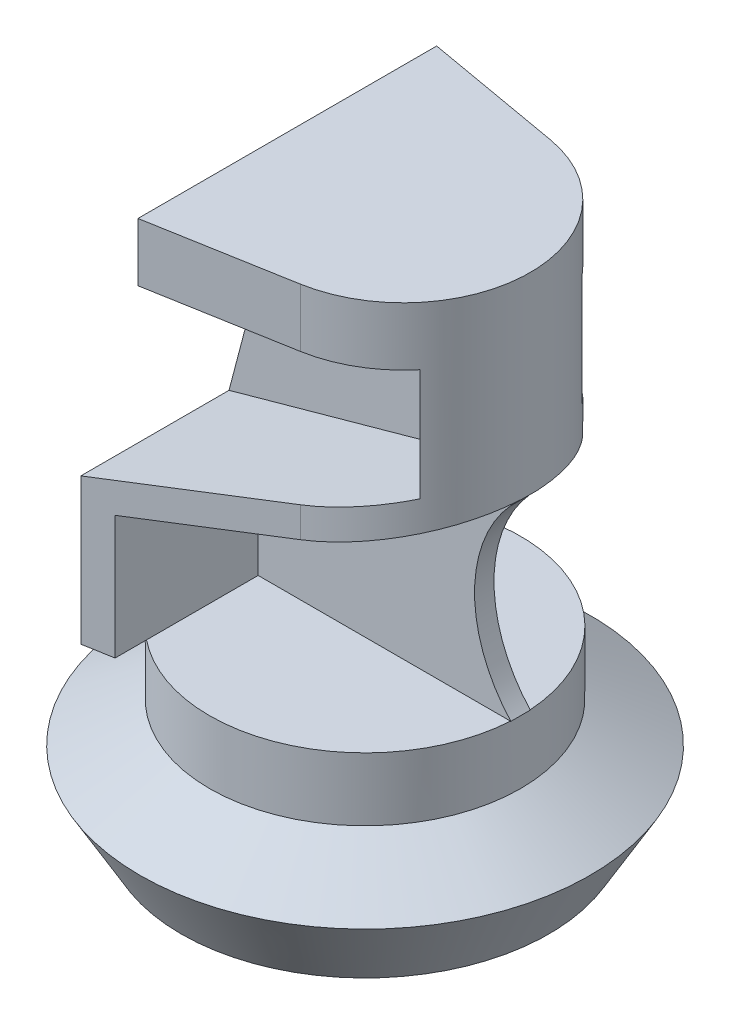
ISO-10303-21;
HEADER;
FILE_DESCRIPTION(('STEP AP214'),'2;1');
FILE_NAME('part.step','',(''),(''),'','','');
FILE_SCHEMA(('AUTOMOTIVE_DESIGN { 1 0 10303 214 1 1 1 1 }'));
ENDSEC;
DATA;
#1=APPLICATION_CONTEXT('core data for automotive mechanical design processes');
#2=APPLICATION_PROTOCOL_DEFINITION('international standard','automotive_design',2000,#1);
#3=PRODUCT_CONTEXT('',#1,'mechanical');
#4=PRODUCT('Part','Part','',(#3));
#5=PRODUCT_RELATED_PRODUCT_CATEGORY('part','',(#4));
#6=PRODUCT_DEFINITION_FORMATION('','',#4);
#7=PRODUCT_DEFINITION_CONTEXT('part definition',#1,'design');
#8=PRODUCT_DEFINITION('design','',#6,#7);
#9=PRODUCT_DEFINITION_SHAPE('','',#8);
#10=(LENGTH_UNIT() NAMED_UNIT(*) SI_UNIT(.MILLI.,.METRE.));
#11=(NAMED_UNIT(*) PLANE_ANGLE_UNIT() SI_UNIT($,.RADIAN.));
#12=(NAMED_UNIT(*) SI_UNIT($,.STERADIAN.) SOLID_ANGLE_UNIT());
#13=UNCERTAINTY_MEASURE_WITH_UNIT(LENGTH_MEASURE(1.E-05),#10,'distance_accuracy_value','');
#14=(GEOMETRIC_REPRESENTATION_CONTEXT(3) GLOBAL_UNCERTAINTY_ASSIGNED_CONTEXT((#13)) GLOBAL_UNIT_ASSIGNED_CONTEXT((#10,
#11,#12)) REPRESENTATION_CONTEXT('',''));
#15=CARTESIAN_POINT('',(0.,0.,0.));
#16=DIRECTION('',(0.,0.,1.));
#17=DIRECTION('',(1.,0.,0.));
#18=AXIS2_PLACEMENT_3D('',#15,#16,#17);
#19=CARTESIAN_POINT('',(0.,68.,40.));
#20=DIRECTION('',(0.,-1.,0.));
#21=DIRECTION('',(0.,0.,-1.));
#22=AXIS2_PLACEMENT_3D('',#19,#20,#21);
#23=PLANE('',#22);
#24=DIRECTION('',(0.,0.,-1.));
#25=VECTOR('',#24,1.);
#26=CARTESIAN_POINT('',(28.,68.,40.));
#27=LINE('',#26,#25);
#28=CARTESIAN_POINT('',(28.,68.,-2.));
#29=VERTEX_POINT('',#28);
#30=CARTESIAN_POINT('',(28.,68.,-16.6578604852397));
#31=VERTEX_POINT('',#30);
#32=EDGE_CURVE('E232',#29,#31,#27,.T.);
#33=ORIENTED_EDGE('',*,*,#32,.F.);
#34=DIRECTION('',(-1.,0.,0.));
#35=VECTOR('',#34,1.);
#36=CARTESIAN_POINT('',(0.,68.,-2.));
#37=LINE('',#36,#35);
#38=CARTESIAN_POINT('',(-16.,68.,-2.));
#39=VERTEX_POINT('',#38);
#40=EDGE_CURVE('E220',#29,#39,#37,.T.);
#41=ORIENTED_EDGE('',*,*,#40,.T.);
#42=DIRECTION('',(0.,0.,-1.));
#43=VECTOR('',#42,1.);
#44=CARTESIAN_POINT('',(-16.,68.,40.));
#45=LINE('',#44,#43);
#46=CARTESIAN_POINT('',(-16.,68.,-30.7367301929154));
#47=VERTEX_POINT('',#46);
#48=EDGE_CURVE('E229',#39,#47,#45,.T.);
#49=ORIENTED_EDGE('',*,*,#48,.T.);
#50=DIRECTION('',(0.984807753012209,0.,0.173648177666927));
#51=VECTOR('',#50,1.);
#52=CARTESIAN_POINT('',(11.6142342657721,68.,-25.8675956402557));
#53=LINE('',#52,#51);
#54=CARTESIAN_POINT('',(12.4126386871188,68.,-25.7268153992553));
#55=VERTEX_POINT('',#54);
#56=EDGE_CURVE('E399',#47,#55,#53,.T.);
#57=ORIENTED_EDGE('',*,*,#56,.T.);
#58=CARTESIAN_POINT('',(7.87630700452419,68.,0.));
#59=DIRECTION('',(0.,-1.,0.));
#60=DIRECTION('',(0.,0.,-1.));
#61=AXIS2_PLACEMENT_3D('',#58,#59,#60);
#62=CIRCLE('',#61,26.1236929954758);
#63=EDGE_CURVE('E377',#55,#31,#62,.T.);
#64=ORIENTED_EDGE('',*,*,#63,.T.);
#65=EDGE_LOOP('',(#33,#41,#49,#57,#64));
#66=FACE_BOUND('',#65,.T.);
#67=ADVANCED_FACE('F38',(#66),#23,.T.);
#68=CARTESIAN_POINT('',(28.,0.,40.));
#69=DIRECTION('',(-1.,0.,0.));
#70=DIRECTION('',(0.,-1.,0.));
#71=AXIS2_PLACEMENT_3D('',#68,#69,#70);
#72=PLANE('',#71);
#73=DIRECTION('',(0.,0.,-1.));
#74=VECTOR('',#73,1.);
#75=CARTESIAN_POINT('',(28.,45.,40.));
#76=LINE('',#75,#74);
#77=CARTESIAN_POINT('',(28.,45.,-2.));
#78=VERTEX_POINT('',#77);
#79=CARTESIAN_POINT('',(28.,45.,-16.6578604852396));
#80=VERTEX_POINT('',#79);
#81=EDGE_CURVE('E473',#78,#80,#76,.T.);
#82=ORIENTED_EDGE('',*,*,#81,.F.);
#83=DIRECTION('',(0.,1.,0.));
#84=VECTOR('',#83,1.);
#85=CARTESIAN_POINT('',(28.,0.,-2.));
#86=LINE('',#85,#84);
#87=EDGE_CURVE('E234',#78,#29,#86,.T.);
#88=ORIENTED_EDGE('',*,*,#87,.T.);
#89=ORIENTED_EDGE('',*,*,#32,.T.);
#90=DIRECTION('',(0.,1.,0.));
#91=VECTOR('',#90,1.);
#92=CARTESIAN_POINT('',(28.,-132.371917523665,-16.6578604852397));
#93=LINE('',#92,#91);
#94=EDGE_CURVE('E373',#31,#80,#93,.F.);
#95=ORIENTED_EDGE('',*,*,#94,.T.);
#96=EDGE_LOOP('',(#82,#88,#89,#95));
#97=FACE_BOUND('',#96,.T.);
#98=ADVANCED_FACE('F478',(#97),#72,.T.);
#99=CARTESIAN_POINT('',(-9.59885386819485,34.5558739255014,40.));
#100=DIRECTION('',(-0.267643863786095,0.963517909629941,0.));
#101=DIRECTION('',(-0.963517909629941,-0.267643863786095,0.));
#102=AXIS2_PLACEMENT_3D('',#99,#100,#101);
#103=PLANE('',#102);
#104=DIRECTION('',(0.,0.,-1.));
#105=VECTOR('',#104,1.);
#106=CARTESIAN_POINT('',(-26.,30.,40.));
#107=LINE('',#106,#105);
#108=CARTESIAN_POINT('',(-26.,30.,-2.));
#109=VERTEX_POINT('',#108);
#110=CARTESIAN_POINT('',(-26.,30.,-32.5));
#111=VERTEX_POINT('',#110);
#112=EDGE_CURVE('E283',#109,#111,#107,.T.);
#113=ORIENTED_EDGE('',*,*,#112,.F.);
#114=DIRECTION('',(0.963517909629941,0.267643863786095,0.));
#115=VECTOR('',#114,1.);
#116=CARTESIAN_POINT('',(-9.59885386819485,34.5558739255014,-2.));
#117=LINE('',#116,#115);
#118=EDGE_CURVE('E223',#109,#78,#117,.T.);
#119=ORIENTED_EDGE('',*,*,#118,.T.);
#120=ORIENTED_EDGE('',*,*,#81,.T.);
#121=CARTESIAN_POINT('',(7.87630700452419,39.4100852790345,0.));
#122=DIRECTION('',(-0.267643863786095,0.963517909629941,0.));
#123=DIRECTION('',(0.963517909629941,0.267643863786095,0.));
#124=AXIS2_PLACEMENT_3D('',#121,#122,#123);
#125=ELLIPSE('',#124,27.1128255472793,26.1236929954758);
#126=CARTESIAN_POINT('',(12.4126386871188,40.6701774130886,-25.7268153992553));
#127=VERTEX_POINT('',#126);
#128=EDGE_CURVE('E370',#80,#127,#125,.T.);
#129=ORIENTED_EDGE('',*,*,#128,.T.);
#130=DIRECTION('',(-0.94990636407934,-0.263862878910928,-0.167494121133863));
#131=VECTOR('',#130,1.);
#132=CARTESIAN_POINT('',(1.47604431761819,37.6322345326717,-27.6552320636625));
#133=LINE('',#132,#131);
#134=EDGE_CURVE('E397',#127,#111,#133,.T.);
#135=ORIENTED_EDGE('',*,*,#134,.T.);
#136=EDGE_LOOP('',(#113,#119,#120,#129,#135));
#137=FACE_BOUND('',#136,.T.);
#138=ADVANCED_FACE('F508',(#137),#103,.T.);
#139=CARTESIAN_POINT('',(-20.,0.,40.));
#140=DIRECTION('',(1.,0.,0.));
#141=DIRECTION('',(0.,0.,-1.));
#142=AXIS2_PLACEMENT_3D('',#139,#140,#141);
#143=PLANE('',#142);
#144=DIRECTION('',(0.,0.,-1.));
#145=VECTOR('',#144,1.);
#146=CARTESIAN_POINT('',(-20.,0.,40.));
#147=LINE('',#146,#145);
#148=CARTESIAN_POINT('',(-20.,0.,-24.9799919935936));
#149=VERTEX_POINT('',#148);
#150=CARTESIAN_POINT('',(-20.,0.,-31.4420381157492));
#151=VERTEX_POINT('',#150);
#152=EDGE_CURVE('E279',#149,#151,#147,.T.);
#153=ORIENTED_EDGE('',*,*,#152,.T.);
#154=DIRECTION('',(0.,1.,0.));
#155=VECTOR('',#154,1.);
#156=CARTESIAN_POINT('',(-20.,0.,-31.4420381157492));
#157=LINE('',#156,#155);
#158=CARTESIAN_POINT('',(-20.,25.4394861025768,-31.4420381157492));
#159=VERTEX_POINT('',#158);
#160=EDGE_CURVE('E405',#151,#159,#157,.T.);
#161=ORIENTED_EDGE('',*,*,#160,.T.);
#162=DIRECTION('',(0.,0.,-1.));
#163=VECTOR('',#162,1.);
#164=CARTESIAN_POINT('',(-20.,25.4394861025768,40.));
#165=LINE('',#164,#163);
#166=CARTESIAN_POINT('',(-20.,25.4394861025768,-2.));
#167=VERTEX_POINT('',#166);
#168=EDGE_CURVE('E249',#167,#159,#165,.T.);
#169=ORIENTED_EDGE('',*,*,#168,.F.);
#170=DIRECTION('',(0.,-1.,0.));
#171=VECTOR('',#170,1.);
#172=CARTESIAN_POINT('',(-20.,0.,-2.));
#173=LINE('',#172,#171);
#174=CARTESIAN_POINT('',(-20.,0.,-2.));
#175=VERTEX_POINT('',#174);
#176=EDGE_CURVE('E328',#167,#175,#173,.T.);
#177=ORIENTED_EDGE('',*,*,#176,.T.);
#178=EDGE_CURVE('E270',#175,#149,#147,.T.);
#179=ORIENTED_EDGE('',*,*,#178,.T.);
#180=EDGE_LOOP('',(#153,#161,#169,#177,#179));
#181=FACE_BOUND('',#180,.T.);
#182=ADVANCED_FACE('F324',(#181),#143,.T.);
#183=CARTESIAN_POINT('',(-7.99299068547828,28.7747664677218,40.));
#184=DIRECTION('',(0.267643863786095,-0.963517909629941,0.));
#185=DIRECTION('',(0.963517909629941,0.267643863786095,0.));
#186=AXIS2_PLACEMENT_3D('',#183,#184,#185);
#187=PLANE('',#186);
#188=ORIENTED_EDGE('',*,*,#168,.T.);
#189=DIRECTION('',(0.94990636407934,0.263862878910928,0.167494121133863));
#190=VECTOR('',#189,1.);
#191=CARTESIAN_POINT('',(3.03685616397849,31.8386128147931,-27.3800188233398));
#192=LINE('',#191,#190);
#193=CARTESIAN_POINT('',(12.4126386871188,34.4429968489987,-25.7268153992553));
#194=VERTEX_POINT('',#193);
#195=EDGE_CURVE('E402',#159,#194,#192,.T.);
#196=ORIENTED_EDGE('',*,*,#195,.T.);
#197=CARTESIAN_POINT('',(7.87630700452419,33.1829047149446,0.));
#198=DIRECTION('',(0.267643863786095,-0.963517909629941,0.));
#199=DIRECTION('',(0.963517909629941,0.267643863786095,0.));
#200=AXIS2_PLACEMENT_3D('',#197,#198,#199);
#201=ELLIPSE('',#200,27.1128255472793,26.1236929954758);
#202=CARTESIAN_POINT('',(33.9233286331456,40.4181885006729,-2.));
#203=VERTEX_POINT('',#202);
#204=EDGE_CURVE('E367',#194,#203,#201,.T.);
#205=ORIENTED_EDGE('',*,*,#204,.T.);
#206=DIRECTION('',(-0.963517909629941,-0.267643863786095,0.));
#207=VECTOR('',#206,1.);
#208=CARTESIAN_POINT('',(-7.99299068547828,28.7747664677218,-2.));
#209=LINE('',#208,#207);
#210=EDGE_CURVE('E421',#203,#167,#209,.T.);
#211=ORIENTED_EDGE('',*,*,#210,.T.);
#212=EDGE_LOOP('',(#188,#196,#205,#211));
#213=FACE_BOUND('',#212,.T.);
#214=ADVANCED_FACE('F513',(#213),#187,.T.);
#215=CARTESIAN_POINT('',(0.,0.,40.));
#216=DIRECTION('',(0.,-1.,0.));
#217=DIRECTION('',(0.,0.,-1.));
#218=AXIS2_PLACEMENT_3D('',#215,#216,#217);
#219=PLANE('',#218);
#220=DIRECTION('',(0.,0.,-1.));
#221=VECTOR('',#220,1.);
#222=CARTESIAN_POINT('',(-26.,0.,40.));
#223=LINE('',#222,#221);
#224=CARTESIAN_POINT('',(-26.,0.,-18.6547581061776));
#225=VERTEX_POINT('',#224);
#226=CARTESIAN_POINT('',(-26.,0.,-32.5));
#227=VERTEX_POINT('',#226);
#228=EDGE_CURVE('E273',#225,#227,#223,.T.);
#229=ORIENTED_EDGE('',*,*,#228,.T.);
#230=DIRECTION('',(0.984807753012209,0.,0.173648177666927));
#231=VECTOR('',#230,1.);
#232=CARTESIAN_POINT('',(12.4126386871188,0.,-25.7268153992553));
#233=LINE('',#232,#231);
#234=EDGE_CURVE('E330',#227,#151,#233,.T.);
#235=ORIENTED_EDGE('',*,*,#234,.T.);
#236=ORIENTED_EDGE('',*,*,#152,.F.);
#237=CARTESIAN_POINT('',(0.,0.,0.));
#238=DIRECTION('',(0.,1.,0.));
#239=DIRECTION('',(0.,0.,1.));
#240=AXIS2_PLACEMENT_3D('',#237,#238,#239);
#241=CIRCLE('',#240,32.);
#242=EDGE_CURVE('E262',#149,#225,#241,.T.);
#243=ORIENTED_EDGE('',*,*,#242,.T.);
#244=EDGE_LOOP('',(#229,#235,#236,#243));
#245=FACE_BOUND('',#244,.T.);
#246=ADVANCED_FACE('F329',(#245),#219,.T.);
#247=CARTESIAN_POINT('',(-20.,25.4394861025768,31.4420381157492));
#248=VERTEX_POINT('',#247);
#249=CARTESIAN_POINT('',(-20.,25.4394861025768,2.));
#250=VERTEX_POINT('',#249);
#251=EDGE_CURVE('E250',#248,#250,#165,.T.);
#252=ORIENTED_EDGE('',*,*,#251,.F.);
#253=DIRECTION('',(0.,-1.,0.));
#254=VECTOR('',#253,1.);
#255=CARTESIAN_POINT('',(-20.,0.,31.4420381157492));
#256=LINE('',#255,#254);
#257=CARTESIAN_POINT('',(-20.,0.,31.4420381157492));
#258=VERTEX_POINT('',#257);
#259=EDGE_CURVE('E395',#248,#258,#256,.T.);
#260=ORIENTED_EDGE('',*,*,#259,.T.);
#261=CARTESIAN_POINT('',(-20.,0.,24.9799919935936));
#262=VERTEX_POINT('',#261);
#263=EDGE_CURVE('E280',#258,#262,#147,.T.);
#264=ORIENTED_EDGE('',*,*,#263,.T.);
#265=CARTESIAN_POINT('',(-20.,0.,2.));
#266=VERTEX_POINT('',#265);
#267=EDGE_CURVE('E52',#262,#266,#147,.T.);
#268=ORIENTED_EDGE('',*,*,#267,.T.);
#269=DIRECTION('',(0.,-1.,0.));
#270=VECTOR('',#269,1.);
#271=CARTESIAN_POINT('',(-20.,0.,2.));
#272=LINE('',#271,#270);
#273=EDGE_CURVE('E299',#250,#266,#272,.T.);
#274=ORIENTED_EDGE('',*,*,#273,.F.);
#275=EDGE_LOOP('',(#252,#260,#264,#268,#274));
#276=FACE_BOUND('',#275,.T.);
#277=ADVANCED_FACE('F298',(#276),#143,.T.);
#278=CARTESIAN_POINT('',(7.87630700452419,33.1829047149446,0.));
#279=DIRECTION('',(0.267643863786095,-0.963517909629941,0.));
#280=DIRECTION('',(0.963517909629941,0.267643863786095,0.));
#281=AXIS2_PLACEMENT_3D('',#278,#279,#280);
#282=ELLIPSE('',#281,27.1128255472793,26.1236929954758);
#283=CARTESIAN_POINT('',(33.9233286331456,40.4181885006729,2.));
#284=VERTEX_POINT('',#283);
#285=CARTESIAN_POINT('',(12.4126386871188,34.4429968489987,25.7268153992553));
#286=VERTEX_POINT('',#285);
#287=EDGE_CURVE('E364',#284,#286,#282,.T.);
#288=ORIENTED_EDGE('',*,*,#287,.T.);
#289=DIRECTION('',(-0.94990636407934,-0.263862878910928,0.167494121133863));
#290=VECTOR('',#289,1.);
#291=CARTESIAN_POINT('',(-9.69144236489607,28.3029743345502,29.6243612724922));
#292=LINE('',#291,#290);
#293=EDGE_CURVE('E392',#286,#248,#292,.T.);
#294=ORIENTED_EDGE('',*,*,#293,.T.);
#295=ORIENTED_EDGE('',*,*,#251,.T.);
#296=DIRECTION('',(-0.963517909629941,-0.267643863786095,0.));
#297=VECTOR('',#296,1.);
#298=CARTESIAN_POINT('',(-7.99299068547828,28.7747664677218,2.));
#299=LINE('',#298,#297);
#300=EDGE_CURVE('E424',#284,#250,#299,.T.);
#301=ORIENTED_EDGE('',*,*,#300,.F.);
#302=EDGE_LOOP('',(#288,#294,#295,#301));
#303=FACE_BOUND('',#302,.T.);
#304=ADVANCED_FACE('F449',(#303),#187,.T.);
#305=CARTESIAN_POINT('',(0.,80.,40.));
#306=DIRECTION('',(0.,1.,0.));
#307=DIRECTION('',(0.,0.,1.));
#308=AXIS2_PLACEMENT_3D('',#305,#306,#307);
#309=PLANE('',#308);
#310=CARTESIAN_POINT('',(7.87630700452419,80.,0.));
#311=DIRECTION('',(0.,1.,0.));
#312=DIRECTION('',(0.,0.,-1.));
#313=AXIS2_PLACEMENT_3D('',#310,#311,#312);
#314=CIRCLE('',#313,26.1236929954758);
#315=CARTESIAN_POINT('',(12.4126386871188,80.,25.7268153992553));
#316=VERTEX_POINT('',#315);
#317=CARTESIAN_POINT('',(12.4126386871188,80.,-25.7268153992553));
#318=VERTEX_POINT('',#317);
#319=EDGE_CURVE('E214',#316,#318,#314,.T.);
#320=ORIENTED_EDGE('',*,*,#319,.T.);
#321=DIRECTION('',(-0.984807753012209,0.,-0.173648177666927));
#322=VECTOR('',#321,1.);
#323=CARTESIAN_POINT('',(12.4126386871188,80.,-25.7268153992553));
#324=LINE('',#323,#322);
#325=CARTESIAN_POINT('',(-16.,80.,-30.7367301929154));
#326=VERTEX_POINT('',#325);
#327=EDGE_CURVE('E458',#318,#326,#324,.T.);
#328=ORIENTED_EDGE('',*,*,#327,.T.);
#329=DIRECTION('',(0.,0.,-1.));
#330=VECTOR('',#329,1.);
#331=CARTESIAN_POINT('',(-16.,80.,40.));
#332=LINE('',#331,#330);
#333=CARTESIAN_POINT('',(-16.,80.,30.7367301929154));
#334=VERTEX_POINT('',#333);
#335=EDGE_CURVE('E243',#334,#326,#332,.T.);
#336=ORIENTED_EDGE('',*,*,#335,.F.);
#337=DIRECTION('',(0.984807753012209,0.,-0.173648177666927));
#338=VECTOR('',#337,1.);
#339=CARTESIAN_POINT('',(-26.,80.,32.5));
#340=LINE('',#339,#338);
#341=EDGE_CURVE('E358',#334,#316,#340,.T.);
#342=ORIENTED_EDGE('',*,*,#341,.T.);
#343=EDGE_LOOP('',(#320,#328,#336,#342));
#344=FACE_BOUND('',#343,.T.);
#345=ADVANCED_FACE('F488',(#344),#309,.T.);
#346=CARTESIAN_POINT('',(-16.,0.,40.));
#347=DIRECTION('',(-1.,0.,0.));
#348=DIRECTION('',(0.,0.,1.));
#349=AXIS2_PLACEMENT_3D('',#346,#347,#348);
#350=PLANE('',#349);
#351=ORIENTED_EDGE('',*,*,#335,.T.);
#352=DIRECTION('',(0.,-1.,0.));
#353=VECTOR('',#352,1.);
#354=CARTESIAN_POINT('',(-16.,0.,-30.7367301929154));
#355=LINE('',#354,#353);
#356=EDGE_CURVE('E239',#326,#47,#355,.T.);
#357=ORIENTED_EDGE('',*,*,#356,.T.);
#358=ORIENTED_EDGE('',*,*,#48,.F.);
#359=DIRECTION('',(0.,0.,-1.));
#360=VECTOR('',#359,1.);
#361=CARTESIAN_POINT('',(-16.,68.,40.));
#362=LINE('',#361,#360);
#363=CARTESIAN_POINT('',(-16.,68.,2.));
#364=VERTEX_POINT('',#363);
#365=EDGE_CURVE('E206',#364,#39,#362,.T.);
#366=ORIENTED_EDGE('',*,*,#365,.F.);
#367=CARTESIAN_POINT('',(-16.,68.,30.7367301929154));
#368=VERTEX_POINT('',#367);
#369=EDGE_CURVE('E240',#368,#364,#45,.T.);
#370=ORIENTED_EDGE('',*,*,#369,.F.);
#371=DIRECTION('',(0.,1.,0.));
#372=VECTOR('',#371,1.);
#373=CARTESIAN_POINT('',(-16.,0.,30.7367301929154));
#374=LINE('',#373,#372);
#375=EDGE_CURVE('E389',#368,#334,#374,.T.);
#376=ORIENTED_EDGE('',*,*,#375,.T.);
#377=EDGE_LOOP('',(#351,#357,#358,#366,#370,#376));
#378=FACE_BOUND('',#377,.T.);
#379=ADVANCED_FACE('F238',(#378),#350,.T.);
#380=DIRECTION('',(-1.,0.,0.));
#381=VECTOR('',#380,1.);
#382=CARTESIAN_POINT('',(0.,68.,2.));
#383=LINE('',#382,#381);
#384=CARTESIAN_POINT('',(28.,68.,2.));
#385=VERTEX_POINT('',#384);
#386=EDGE_CURVE('E494',#385,#364,#383,.T.);
#387=ORIENTED_EDGE('',*,*,#386,.F.);
#388=CARTESIAN_POINT('',(28.,68.,16.6578604852397));
#389=VERTEX_POINT('',#388);
#390=EDGE_CURVE('E241',#389,#385,#27,.T.);
#391=ORIENTED_EDGE('',*,*,#390,.F.);
#392=CARTESIAN_POINT('',(12.4126386871188,68.,25.7268153992553));
#393=VERTEX_POINT('',#392);
#394=EDGE_CURVE('E379',#389,#393,#62,.T.);
#395=ORIENTED_EDGE('',*,*,#394,.T.);
#396=DIRECTION('',(-0.984807753012209,0.,0.173648177666927));
#397=VECTOR('',#396,1.);
#398=CARTESIAN_POINT('',(-2.0665714672544,68.,28.2798908088192));
#399=LINE('',#398,#397);
#400=EDGE_CURVE('E386',#393,#368,#399,.T.);
#401=ORIENTED_EDGE('',*,*,#400,.T.);
#402=ORIENTED_EDGE('',*,*,#369,.T.);
#403=EDGE_LOOP('',(#387,#391,#395,#401,#402));
#404=FACE_BOUND('',#403,.T.);
#405=ADVANCED_FACE('F492',(#404),#23,.T.);
#406=DIRECTION('',(0.,1.,0.));
#407=VECTOR('',#406,1.);
#408=CARTESIAN_POINT('',(28.,0.,2.));
#409=LINE('',#408,#407);
#410=CARTESIAN_POINT('',(28.,45.,2.));
#411=VERTEX_POINT('',#410);
#412=EDGE_CURVE('E498',#411,#385,#409,.T.);
#413=ORIENTED_EDGE('',*,*,#412,.F.);
#414=CARTESIAN_POINT('',(28.,45.,16.6578604852396));
#415=VERTEX_POINT('',#414);
#416=EDGE_CURVE('E474',#415,#411,#76,.T.);
#417=ORIENTED_EDGE('',*,*,#416,.F.);
#418=DIRECTION('',(0.,1.,0.));
#419=VECTOR('',#418,1.);
#420=CARTESIAN_POINT('',(28.,-132.371917523665,16.6578604852397));
#421=LINE('',#420,#419);
#422=EDGE_CURVE('E380',#415,#389,#421,.T.);
#423=ORIENTED_EDGE('',*,*,#422,.T.);
#424=ORIENTED_EDGE('',*,*,#390,.T.);
#425=EDGE_LOOP('',(#413,#417,#423,#424));
#426=FACE_BOUND('',#425,.T.);
#427=ADVANCED_FACE('F497',(#426),#72,.T.);
#428=DIRECTION('',(0.963517909629941,0.267643863786095,0.));
#429=VECTOR('',#428,1.);
#430=CARTESIAN_POINT('',(-9.59885386819485,34.5558739255014,2.));
#431=LINE('',#430,#429);
#432=CARTESIAN_POINT('',(-26.,30.,2.));
#433=VERTEX_POINT('',#432);
#434=EDGE_CURVE('E233',#433,#411,#431,.T.);
#435=ORIENTED_EDGE('',*,*,#434,.F.);
#436=CARTESIAN_POINT('',(-26.,30.,32.5));
#437=VERTEX_POINT('',#436);
#438=EDGE_CURVE('E472',#437,#433,#107,.T.);
#439=ORIENTED_EDGE('',*,*,#438,.F.);
#440=DIRECTION('',(0.94990636407934,0.263862878910928,-0.167494121133863));
#441=VECTOR('',#440,1.);
#442=CARTESIAN_POINT('',(-11.2522542112564,34.0965960524288,29.8995745128149));
#443=LINE('',#442,#441);
#444=CARTESIAN_POINT('',(12.4126386871188,40.6701774130886,25.7268153992553));
#445=VERTEX_POINT('',#444);
#446=EDGE_CURVE('E383',#437,#445,#443,.T.);
#447=ORIENTED_EDGE('',*,*,#446,.T.);
#448=EDGE_CURVE('E374',#445,#415,#125,.T.);
#449=ORIENTED_EDGE('',*,*,#448,.T.);
#450=ORIENTED_EDGE('',*,*,#416,.T.);
#451=EDGE_LOOP('',(#435,#439,#447,#449,#450));
#452=FACE_BOUND('',#451,.T.);
#453=ADVANCED_FACE('F469',(#452),#103,.T.);
#454=CARTESIAN_POINT('',(-26.,0.,40.));
#455=DIRECTION('',(-1.,0.,0.));
#456=DIRECTION('',(0.,0.,1.));
#457=AXIS2_PLACEMENT_3D('',#454,#455,#456);
#458=PLANE('',#457);
#459=ORIENTED_EDGE('',*,*,#438,.T.);
#460=DIRECTION('',(0.,0.,-1.));
#461=VECTOR('',#460,1.);
#462=CARTESIAN_POINT('',(-26.,30.,40.));
#463=LINE('',#462,#461);
#464=EDGE_CURVE('E215',#433,#109,#463,.T.);
#465=ORIENTED_EDGE('',*,*,#464,.T.);
#466=ORIENTED_EDGE('',*,*,#112,.T.);
#467=DIRECTION('',(0.,1.,0.));
#468=VECTOR('',#467,1.);
#469=CARTESIAN_POINT('',(-26.,-132.371917523665,-32.5));
#470=LINE('',#469,#468);
#471=EDGE_CURVE('E343',#227,#111,#470,.T.);
#472=ORIENTED_EDGE('',*,*,#471,.F.);
#473=ORIENTED_EDGE('',*,*,#228,.F.);
#474=CARTESIAN_POINT('',(-26.,0.,18.6547581061776));
#475=VERTEX_POINT('',#474);
#476=EDGE_CURVE('E267',#475,#225,#223,.T.);
#477=ORIENTED_EDGE('',*,*,#476,.F.);
#478=CARTESIAN_POINT('',(-26.,0.,32.5));
#479=VERTEX_POINT('',#478);
#480=EDGE_CURVE('E272',#479,#475,#223,.T.);
#481=ORIENTED_EDGE('',*,*,#480,.F.);
#482=DIRECTION('',(0.,1.,0.));
#483=VECTOR('',#482,1.);
#484=CARTESIAN_POINT('',(-26.,-132.371917523665,32.5));
#485=LINE('',#484,#483);
#486=EDGE_CURVE('E347',#479,#437,#485,.T.);
#487=ORIENTED_EDGE('',*,*,#486,.T.);
#488=EDGE_LOOP('',(#459,#465,#466,#472,#473,#477,#481,#487));
#489=FACE_BOUND('',#488,.T.);
#490=ADVANCED_FACE('F340',(#489),#458,.T.);
#491=ORIENTED_EDGE('',*,*,#263,.F.);
#492=DIRECTION('',(-0.984807753012209,0.,0.173648177666927));
#493=VECTOR('',#492,1.);
#494=CARTESIAN_POINT('',(-26.,0.,32.5));
#495=LINE('',#494,#493);
#496=EDGE_CURVE('E336',#258,#479,#495,.T.);
#497=ORIENTED_EDGE('',*,*,#496,.T.);
#498=ORIENTED_EDGE('',*,*,#480,.T.);
#499=EDGE_CURVE('E312',#475,#262,#241,.T.);
#500=ORIENTED_EDGE('',*,*,#499,.T.);
#501=EDGE_LOOP('',(#491,#497,#498,#500));
#502=FACE_BOUND('',#501,.T.);
#503=ADVANCED_FACE('F335',(#502),#219,.T.);
#504=CARTESIAN_POINT('',(0.,22.0000000000001,2.));
#505=DIRECTION('',(0.,0.,1.));
#506=DIRECTION('',(1.,0.,0.));
#507=AXIS2_PLACEMENT_3D('',#504,#505,#506);
#508=PLANE('',#507);
#509=CARTESIAN_POINT('',(53.0357208589599,19.2288441655737,2.));
#510=DIRECTION('',(0.,0.,1.));
#511=DIRECTION('',(1.,0.,0.));
#512=AXIS2_PLACEMENT_3D('',#509,#510,#511);
#513=CIRCLE('',#512,28.5);
#514=CARTESIAN_POINT('',(33.9233286331456,40.3704255493451,2.));
#515=VERTEX_POINT('',#514);
#516=CARTESIAN_POINT('',(32.,0.,2.));
#517=VERTEX_POINT('',#516);
#518=EDGE_CURVE('E412',#515,#517,#513,.T.);
#519=ORIENTED_EDGE('',*,*,#518,.F.);
#520=DIRECTION('',(0.,1.,0.));
#521=VECTOR('',#520,1.);
#522=CARTESIAN_POINT('',(33.9233286331456,-132.371917523665,2.));
#523=LINE('',#522,#521);
#524=EDGE_CURVE('E67',#515,#284,#523,.T.);
#525=ORIENTED_EDGE('',*,*,#524,.T.);
#526=ORIENTED_EDGE('',*,*,#300,.T.);
#527=ORIENTED_EDGE('',*,*,#273,.T.);
#528=DIRECTION('',(1.,0.,0.));
#529=VECTOR('',#528,1.);
#530=CARTESIAN_POINT('',(0.,0.,2.));
#531=LINE('',#530,#529);
#532=CARTESIAN_POINT('',(31.9374388453426,0.,2.));
#533=VERTEX_POINT('',#532);
#534=EDGE_CURVE('E306',#533,#266,#531,.F.);
#535=ORIENTED_EDGE('',*,*,#534,.F.);
#536=EDGE_CURVE('E408',#517,#533,#531,.F.);
#537=ORIENTED_EDGE('',*,*,#536,.F.);
#538=EDGE_LOOP('',(#519,#525,#526,#527,#535,#537));
#539=FACE_BOUND('',#538,.T.);
#540=ADVANCED_FACE('F446',(#539),#508,.T.);
#541=CARTESIAN_POINT('',(0.,22.0000000000001,-2.));
#542=DIRECTION('',(0.,0.,1.));
#543=DIRECTION('',(1.,0.,0.));
#544=AXIS2_PLACEMENT_3D('',#541,#542,#543);
#545=PLANE('',#544);
#546=DIRECTION('',(0.,1.,0.));
#547=VECTOR('',#546,1.);
#548=CARTESIAN_POINT('',(33.9233286331456,-132.371917523665,-2.));
#549=LINE('',#548,#547);
#550=CARTESIAN_POINT('',(33.9233286331456,40.3704255493451,-2.));
#551=VERTEX_POINT('',#550);
#552=EDGE_CURVE('E361',#551,#203,#549,.T.);
#553=ORIENTED_EDGE('',*,*,#552,.F.);
#554=CARTESIAN_POINT('',(53.0357208589599,19.2288441655737,-2.));
#555=DIRECTION('',(0.,0.,1.));
#556=DIRECTION('',(1.,0.,0.));
#557=AXIS2_PLACEMENT_3D('',#554,#555,#556);
#558=CIRCLE('',#557,28.5);
#559=CARTESIAN_POINT('',(32.,0.,-2.));
#560=VERTEX_POINT('',#559);
#561=EDGE_CURVE('E407',#551,#560,#558,.T.);
#562=ORIENTED_EDGE('',*,*,#561,.T.);
#563=DIRECTION('',(1.,0.,0.));
#564=VECTOR('',#563,1.);
#565=CARTESIAN_POINT('',(0.,0.,-2.));
#566=LINE('',#565,#564);
#567=CARTESIAN_POINT('',(31.9374388453426,0.,-2.));
#568=VERTEX_POINT('',#567);
#569=EDGE_CURVE('E414',#560,#568,#566,.F.);
#570=ORIENTED_EDGE('',*,*,#569,.T.);
#571=EDGE_CURVE('E319',#568,#175,#566,.F.);
#572=ORIENTED_EDGE('',*,*,#571,.T.);
#573=ORIENTED_EDGE('',*,*,#176,.F.);
#574=ORIENTED_EDGE('',*,*,#210,.F.);
#575=EDGE_LOOP('',(#553,#562,#570,#572,#573,#574));
#576=FACE_BOUND('',#575,.T.);
#577=ADVANCED_FACE('F443',(#576),#545,.F.);
#578=CARTESIAN_POINT('',(53.0357208589599,19.2288441655737,0.));
#579=DIRECTION('',(0.,0.,1.));
#580=DIRECTION('',(1.,0.,0.));
#581=AXIS2_PLACEMENT_3D('',#578,#579,#580);
#582=CYLINDRICAL_SURFACE('',#581,28.5);
#583=ORIENTED_EDGE('',*,*,#561,.F.);
#584=CARTESIAN_POINT('',(33.9233286331456,40.3704255493451,-2.));
#585=CARTESIAN_POINT('',(33.9488797829895,40.3935032764674,-1.66740847986135));
#586=CARTESIAN_POINT('',(33.9680646180499,40.4107836379669,-1.33392777861019));
#587=CARTESIAN_POINT('',(33.9936078011716,40.4337597645622,-0.666963151733266));
#588=CARTESIAN_POINT('',(34.,40.4394861032437,-0.333481575866633));
#589=CARTESIAN_POINT('',(34.,40.4394861032437,0.333481575866634));
#590=CARTESIAN_POINT('',(33.9936078011716,40.4337597645622,0.666963151733267));
#591=CARTESIAN_POINT('',(33.9680646180499,40.4107836379669,1.33392777861019));
#592=CARTESIAN_POINT('',(33.9488797829895,40.3935032764674,1.66740847986135));
#593=CARTESIAN_POINT('',(33.9233286331456,40.3704255493451,2.));
#594=B_SPLINE_CURVE_WITH_KNOTS('',3,(#584,#585,#586,#587,#588,#589,#590,#591,#592,#593),
.UNSPECIFIED.,.F.,.F.,(4,2,2,2,4),(0.,1.00299178514216,2.00332601236121,3.00366023958027,
4.00665202472243),.UNSPECIFIED.);
#595=EDGE_CURVE('E12',#551,#515,#594,.T.);
#596=ORIENTED_EDGE('',*,*,#595,.T.);
#597=ORIENTED_EDGE('',*,*,#518,.T.);
#598=DIRECTION('',(0.,0.,1.));
#599=VECTOR('',#598,1.);
#600=CARTESIAN_POINT('',(32.,0.,0.));
#601=LINE('',#600,#599);
#602=CARTESIAN_POINT('',(32.,0.,0.));
#603=VERTEX_POINT('',#602);
#604=EDGE_CURVE('E411',#603,#517,#601,.T.);
#605=ORIENTED_EDGE('',*,*,#604,.F.);
#606=EDGE_CURVE('E418',#560,#603,#601,.T.);
#607=ORIENTED_EDGE('',*,*,#606,.F.);
#608=EDGE_LOOP('',(#583,#596,#597,#605,#607));
#609=FACE_BOUND('',#608,.T.);
#610=ADVANCED_FACE('F438',(#609),#582,.F.);
#611=CARTESIAN_POINT('',(0.,0.,0.));
#612=DIRECTION('',(0.,1.,0.));
#613=DIRECTION('',(0.,0.,1.));
#614=AXIS2_PLACEMENT_3D('',#611,#612,#613);
#615=PLANE('',#614);
#616=EDGE_CURVE('E261',#568,#149,#241,.T.);
#617=ORIENTED_EDGE('',*,*,#616,.T.);
#618=ORIENTED_EDGE('',*,*,#178,.F.);
#619=ORIENTED_EDGE('',*,*,#571,.F.);
#620=EDGE_LOOP('',(#617,#618,#619));
#621=FACE_BOUND('',#620,.T.);
#622=ADVANCED_FACE('F318',(#621),#615,.T.);
#623=ORIENTED_EDGE('',*,*,#476,.T.);
#624=EDGE_CURVE('E265',#225,#475,#241,.T.);
#625=ORIENTED_EDGE('',*,*,#624,.T.);
#626=EDGE_LOOP('',(#623,#625));
#627=FACE_BOUND('',#626,.T.);
#628=ADVANCED_FACE('F331',(#627),#615,.T.);
#629=CARTESIAN_POINT('',(0.,-35.9999999999999,0.));
#630=DIRECTION('',(0.,-1.,0.));
#631=DIRECTION('',(0.,0.,-1.));
#632=AXIS2_PLACEMENT_3D('',#629,#630,#631);
#633=CONICAL_SURFACE('',#632,37.837168574084,1.0471975511966);
#634=CARTESIAN_POINT('',(0.,-31.0492588769186,0.));
#635=DIRECTION('',(0.,1.,0.));
#636=DIRECTION('',(0.,0.,1.));
#637=AXIS2_PLACEMENT_3D('',#634,#635,#636);
#638=CIRCLE('',#637,29.2622334137866);
#639=CARTESIAN_POINT('',(0.,-31.0492588769186,29.2622334137866));
#640=VERTEX_POINT('',#639);
#641=EDGE_CURVE('E264',#640,#640,#638,.T.);
#642=ORIENTED_EDGE('',*,*,#641,.T.);
#643=EDGE_LOOP('',(#642));
#644=FACE_BOUND('',#643,.T.);
#645=CARTESIAN_POINT('',(0.,-35.9999999999999,0.));
#646=DIRECTION('',(0.,1.,0.));
#647=DIRECTION('',(0.,0.,1.));
#648=AXIS2_PLACEMENT_3D('',#645,#646,#647);
#649=CIRCLE('',#648,37.837168574084);
#650=CARTESIAN_POINT('',(0.,-35.9999999999999,37.837168574084));
#651=VERTEX_POINT('',#650);
#652=EDGE_CURVE('E252',#651,#651,#649,.T.);
#653=ORIENTED_EDGE('',*,*,#652,.F.);
#654=EDGE_LOOP('',(#653));
#655=FACE_BOUND('',#654,.T.);
#656=ADVANCED_FACE('F40',(#644,#655),#633,.F.);
#657=CARTESIAN_POINT('',(0.,-44.,0.));
#658=DIRECTION('',(0.,1.,0.));
#659=DIRECTION('',(-1.,0.,0.));
#660=AXIS2_PLACEMENT_3D('',#657,#658,#659);
#661=SPHERICAL_SURFACE('',#660,32.);
#662=ORIENTED_EDGE('',*,*,#641,.F.);
#663=EDGE_LOOP('',(#662));
#664=FACE_BOUND('',#663,.T.);
#665=ADVANCED_FACE('F620',(#664),#661,.F.);
#666=EDGE_CURVE('E304',#262,#533,#241,.T.);
#667=ORIENTED_EDGE('',*,*,#666,.T.);
#668=ORIENTED_EDGE('',*,*,#534,.T.);
#669=ORIENTED_EDGE('',*,*,#267,.F.);
#670=EDGE_LOOP('',(#667,#668,#669));
#671=FACE_BOUND('',#670,.T.);
#672=ADVANCED_FACE('F303',(#671),#615,.T.);
#673=CARTESIAN_POINT('',(0.,0.,0.));
#674=DIRECTION('',(0.,1.,0.));
#675=DIRECTION('',(0.,0.,1.));
#676=AXIS2_PLACEMENT_3D('',#673,#674,#675);
#677=CYLINDRICAL_SURFACE('',#676,32.);
#678=CARTESIAN_POINT('',(0.,-13.,0.));
#679=DIRECTION('',(0.,1.,0.));
#680=DIRECTION('',(0.,0.,1.));
#681=AXIS2_PLACEMENT_3D('',#678,#679,#680);
#682=CIRCLE('',#681,32.);
#683=CARTESIAN_POINT('',(0.,-13.,32.));
#684=VERTEX_POINT('',#683);
#685=EDGE_CURVE('E258',#684,#684,#682,.T.);
#686=ORIENTED_EDGE('',*,*,#685,.T.);
#687=EDGE_LOOP('',(#686));
#688=FACE_BOUND('',#687,.T.);
#689=CARTESIAN_POINT('',(0.,0.,0.));
#690=DIRECTION('',(0.,1.,0.));
#691=DIRECTION('',(0.,0.,1.));
#692=AXIS2_PLACEMENT_3D('',#689,#690,#691);
#693=CIRCLE('',#692,32.);
#694=EDGE_CURVE('E293',#533,#603,#693,.T.);
#695=ORIENTED_EDGE('',*,*,#694,.F.);
#696=ORIENTED_EDGE('',*,*,#666,.F.);
#697=ORIENTED_EDGE('',*,*,#499,.F.);
#698=ORIENTED_EDGE('',*,*,#624,.F.);
#699=ORIENTED_EDGE('',*,*,#242,.F.);
#700=ORIENTED_EDGE('',*,*,#616,.F.);
#701=EDGE_CURVE('E427',#603,#568,#693,.T.);
#702=ORIENTED_EDGE('',*,*,#701,.F.);
#703=EDGE_LOOP('',(#695,#696,#697,#698,#699,#700,#702));
#704=FACE_BOUND('',#703,.T.);
#705=ADVANCED_FACE('F310',(#688,#704),#677,.T.);
#706=CARTESIAN_POINT('',(0.,-13.,0.));
#707=DIRECTION('',(0.,-1.,0.));
#708=DIRECTION('',(0.,0.,-1.));
#709=AXIS2_PLACEMENT_3D('',#706,#707,#708);
#710=CONICAL_SURFACE('',#709,32.,1.04719755119659);
#711=ORIENTED_EDGE('',*,*,#685,.F.);
#712=EDGE_LOOP('',(#711));
#713=FACE_BOUND('',#712,.T.);
#714=CARTESIAN_POINT('',(0.,-21.2775681356646,0.));
#715=DIRECTION('',(0.,1.,0.));
#716=DIRECTION('',(0.,0.,1.));
#717=AXIS2_PLACEMENT_3D('',#714,#715,#716);
#718=CIRCLE('',#717,46.337168574084);
#719=CARTESIAN_POINT('',(0.,-21.2775681356646,46.337168574084));
#720=VERTEX_POINT('',#719);
#721=EDGE_CURVE('E255',#720,#720,#718,.T.);
#722=ORIENTED_EDGE('',*,*,#721,.T.);
#723=EDGE_LOOP('',(#722));
#724=FACE_BOUND('',#723,.T.);
#725=ADVANCED_FACE('F596',(#713,#724),#710,.T.);
#726=CARTESIAN_POINT('',(0.,-21.2775681356646,0.));
#727=DIRECTION('',(0.,1.,0.));
#728=DIRECTION('',(0.,0.,1.));
#729=AXIS2_PLACEMENT_3D('',#726,#727,#728);
#730=CONICAL_SURFACE('',#729,46.337168574084,0.523598775598303);
#731=ORIENTED_EDGE('',*,*,#652,.T.);
#732=EDGE_LOOP('',(#731));
#733=FACE_BOUND('',#732,.T.);
#734=ORIENTED_EDGE('',*,*,#721,.F.);
#735=EDGE_LOOP('',(#734));
#736=FACE_BOUND('',#735,.T.);
#737=ADVANCED_FACE('F587',(#733,#736),#730,.T.);
#738=CARTESIAN_POINT('',(32.,0.,0.));
#739=DIRECTION('',(0.,1.,0.));
#740=DIRECTION('',(-1.,0.,0.));
#741=AXIS2_PLACEMENT_3D('',#738,#739,#740);
#742=PLANE('',#741);
#743=ORIENTED_EDGE('',*,*,#536,.T.);
#744=ORIENTED_EDGE('',*,*,#694,.T.);
#745=ORIENTED_EDGE('',*,*,#604,.T.);
#746=EDGE_LOOP('',(#743,#744,#745));
#747=FACE_BOUND('',#746,.T.);
#748=ADVANCED_FACE('F433',(#747),#742,.F.);
#749=ORIENTED_EDGE('',*,*,#606,.T.);
#750=ORIENTED_EDGE('',*,*,#701,.T.);
#751=ORIENTED_EDGE('',*,*,#569,.F.);
#752=EDGE_LOOP('',(#749,#750,#751));
#753=FACE_BOUND('',#752,.T.);
#754=ADVANCED_FACE('F440',(#753),#742,.F.);
#755=CARTESIAN_POINT('',(12.4126386871188,-132.371917523665,-25.7268153992553));
#756=DIRECTION('',(0.173648177666927,0.,-0.984807753012209));
#757=DIRECTION('',(-0.984807753012209,0.,-0.173648177666927));
#758=AXIS2_PLACEMENT_3D('',#755,#756,#757);
#759=PLANE('',#758);
#760=ORIENTED_EDGE('',*,*,#327,.F.);
#761=DIRECTION('',(0.,1.,0.));
#762=VECTOR('',#761,1.);
#763=CARTESIAN_POINT('',(12.4126386871188,-132.371917523665,-25.7268153992553));
#764=LINE('',#763,#762);
#765=EDGE_CURVE('E353',#55,#318,#764,.T.);
#766=ORIENTED_EDGE('',*,*,#765,.F.);
#767=ORIENTED_EDGE('',*,*,#56,.F.);
#768=ORIENTED_EDGE('',*,*,#356,.F.);
#769=EDGE_LOOP('',(#760,#766,#767,#768));
#770=FACE_BOUND('',#769,.T.);
#771=ADVANCED_FACE('F484',(#770),#759,.T.);
#772=CARTESIAN_POINT('',(-26.,-132.371917523665,32.5));
#773=DIRECTION('',(0.173648177666927,0.,0.984807753012209));
#774=DIRECTION('',(0.984807753012209,0.,-0.173648177666927));
#775=AXIS2_PLACEMENT_3D('',#772,#773,#774);
#776=PLANE('',#775);
#777=ORIENTED_EDGE('',*,*,#400,.F.);
#778=DIRECTION('',(0.,1.,0.));
#779=VECTOR('',#778,1.);
#780=CARTESIAN_POINT('',(12.4126386871188,-132.371917523665,25.7268153992553));
#781=LINE('',#780,#779);
#782=EDGE_CURVE('E350',#393,#316,#781,.T.);
#783=ORIENTED_EDGE('',*,*,#782,.T.);
#784=ORIENTED_EDGE('',*,*,#341,.F.);
#785=ORIENTED_EDGE('',*,*,#375,.F.);
#786=EDGE_LOOP('',(#777,#783,#784,#785));
#787=FACE_BOUND('',#786,.T.);
#788=ADVANCED_FACE('F489',(#787),#776,.T.);
#789=CARTESIAN_POINT('',(7.87630700452419,-132.371917523665,0.));
#790=DIRECTION('',(0.,1.,0.));
#791=DIRECTION('',(0.,0.,1.));
#792=AXIS2_PLACEMENT_3D('',#789,#790,#791);
#793=CYLINDRICAL_SURFACE('',#792,26.1236929954758);
#794=ORIENTED_EDGE('',*,*,#287,.F.);
#795=ORIENTED_EDGE('',*,*,#524,.F.);
#796=ORIENTED_EDGE('',*,*,#595,.F.);
#797=ORIENTED_EDGE('',*,*,#552,.T.);
#798=ORIENTED_EDGE('',*,*,#204,.F.);
#799=EDGE_CURVE('E348',#194,#127,#764,.T.);
#800=ORIENTED_EDGE('',*,*,#799,.T.);
#801=ORIENTED_EDGE('',*,*,#128,.F.);
#802=ORIENTED_EDGE('',*,*,#94,.F.);
#803=ORIENTED_EDGE('',*,*,#63,.F.);
#804=ORIENTED_EDGE('',*,*,#765,.T.);
#805=ORIENTED_EDGE('',*,*,#319,.F.);
#806=ORIENTED_EDGE('',*,*,#782,.F.);
#807=ORIENTED_EDGE('',*,*,#394,.F.);
#808=ORIENTED_EDGE('',*,*,#422,.F.);
#809=ORIENTED_EDGE('',*,*,#448,.F.);
#810=EDGE_CURVE('E360',#286,#445,#781,.T.);
#811=ORIENTED_EDGE('',*,*,#810,.F.);
#812=EDGE_LOOP('',(#794,#795,#796,#797,#798,#800,#801,#802,#803,#804,#805,#806,#807,#808,#809,#811));
#813=FACE_BOUND('',#812,.T.);
#814=ADVANCED_FACE('F480',(#813),#793,.T.);
#815=ORIENTED_EDGE('',*,*,#234,.F.);
#816=ORIENTED_EDGE('',*,*,#471,.T.);
#817=ORIENTED_EDGE('',*,*,#134,.F.);
#818=ORIENTED_EDGE('',*,*,#799,.F.);
#819=ORIENTED_EDGE('',*,*,#195,.F.);
#820=ORIENTED_EDGE('',*,*,#160,.F.);
#821=EDGE_LOOP('',(#815,#816,#817,#818,#819,#820));
#822=FACE_BOUND('',#821,.T.);
#823=ADVANCED_FACE('F510',(#822),#759,.T.);
#824=ORIENTED_EDGE('',*,*,#293,.F.);
#825=ORIENTED_EDGE('',*,*,#810,.T.);
#826=ORIENTED_EDGE('',*,*,#446,.F.);
#827=ORIENTED_EDGE('',*,*,#486,.F.);
#828=ORIENTED_EDGE('',*,*,#496,.F.);
#829=ORIENTED_EDGE('',*,*,#259,.F.);
#830=EDGE_LOOP('',(#824,#825,#826,#827,#828,#829));
#831=FACE_BOUND('',#830,.T.);
#832=ADVANCED_FACE('F451',(#831),#776,.T.);
#833=CARTESIAN_POINT('',(-16.,68.,0.));
#834=DIRECTION('',(-0.967074537262646,0.254493299279643,0.));
#835=DIRECTION('',(-0.254493299279643,-0.967074537262647,0.));
#836=AXIS2_PLACEMENT_3D('',#833,#834,#835);
#837=PLANE('',#836);
#838=DIRECTION('',(-0.254493299279643,-0.967074537262647,0.));
#839=VECTOR('',#838,1.);
#840=CARTESIAN_POINT('',(-16.,68.,2.));
#841=LINE('',#840,#839);
#842=EDGE_CURVE('E209',#364,#433,#841,.T.);
#843=ORIENTED_EDGE('',*,*,#842,.F.);
#844=ORIENTED_EDGE('',*,*,#365,.T.);
#845=DIRECTION('',(-0.254493299279643,-0.967074537262647,0.));
#846=VECTOR('',#845,1.);
#847=CARTESIAN_POINT('',(-16.,68.,-2.));
#848=LINE('',#847,#846);
#849=EDGE_CURVE('E59',#39,#109,#848,.T.);
#850=ORIENTED_EDGE('',*,*,#849,.T.);
#851=ORIENTED_EDGE('',*,*,#464,.F.);
#852=EDGE_LOOP('',(#843,#844,#850,#851));
#853=FACE_BOUND('',#852,.T.);
#854=ADVANCED_FACE('F207',(#853),#837,.T.);
#855=CARTESIAN_POINT('',(0.,22.0000000000001,2.));
#856=DIRECTION('',(0.,0.,1.));
#857=DIRECTION('',(1.,0.,0.));
#858=AXIS2_PLACEMENT_3D('',#855,#856,#857);
#859=PLANE('',#858);
#860=ORIENTED_EDGE('',*,*,#412,.T.);
#861=ORIENTED_EDGE('',*,*,#386,.T.);
#862=ORIENTED_EDGE('',*,*,#842,.T.);
#863=ORIENTED_EDGE('',*,*,#434,.T.);
#864=EDGE_LOOP('',(#860,#861,#862,#863));
#865=FACE_BOUND('',#864,.T.);
#866=ADVANCED_FACE('F503',(#865),#859,.T.);
#867=CARTESIAN_POINT('',(0.,22.0000000000001,-2.));
#868=DIRECTION('',(0.,0.,1.));
#869=DIRECTION('',(1.,0.,0.));
#870=AXIS2_PLACEMENT_3D('',#867,#868,#869);
#871=PLANE('',#870);
#872=ORIENTED_EDGE('',*,*,#40,.F.);
#873=ORIENTED_EDGE('',*,*,#87,.F.);
#874=ORIENTED_EDGE('',*,*,#118,.F.);
#875=ORIENTED_EDGE('',*,*,#849,.F.);
#876=EDGE_LOOP('',(#872,#873,#874,#875));
#877=FACE_BOUND('',#876,.T.);
#878=ADVANCED_FACE('F219',(#877),#871,.F.);
#879=CLOSED_SHELL('',(#67,#98,#138,#182,#214,#246,#277,#304,#345,#379,#405,#427,#453,#490,#503,
#540,#577,#610,#622,#628,#656,#665,#672,#705,#725,#737,#748,#754,#771,#788,#814,#823,#832,#854,
#866,#878));
#880=MANIFOLD_SOLID_BREP('B2',#879);
#881=ADVANCED_BREP_SHAPE_REPRESENTATION('',(#18,#880),#14);
#882=SHAPE_DEFINITION_REPRESENTATION(#9,#881);
ENDSEC;
END-ISO-10303-21;
